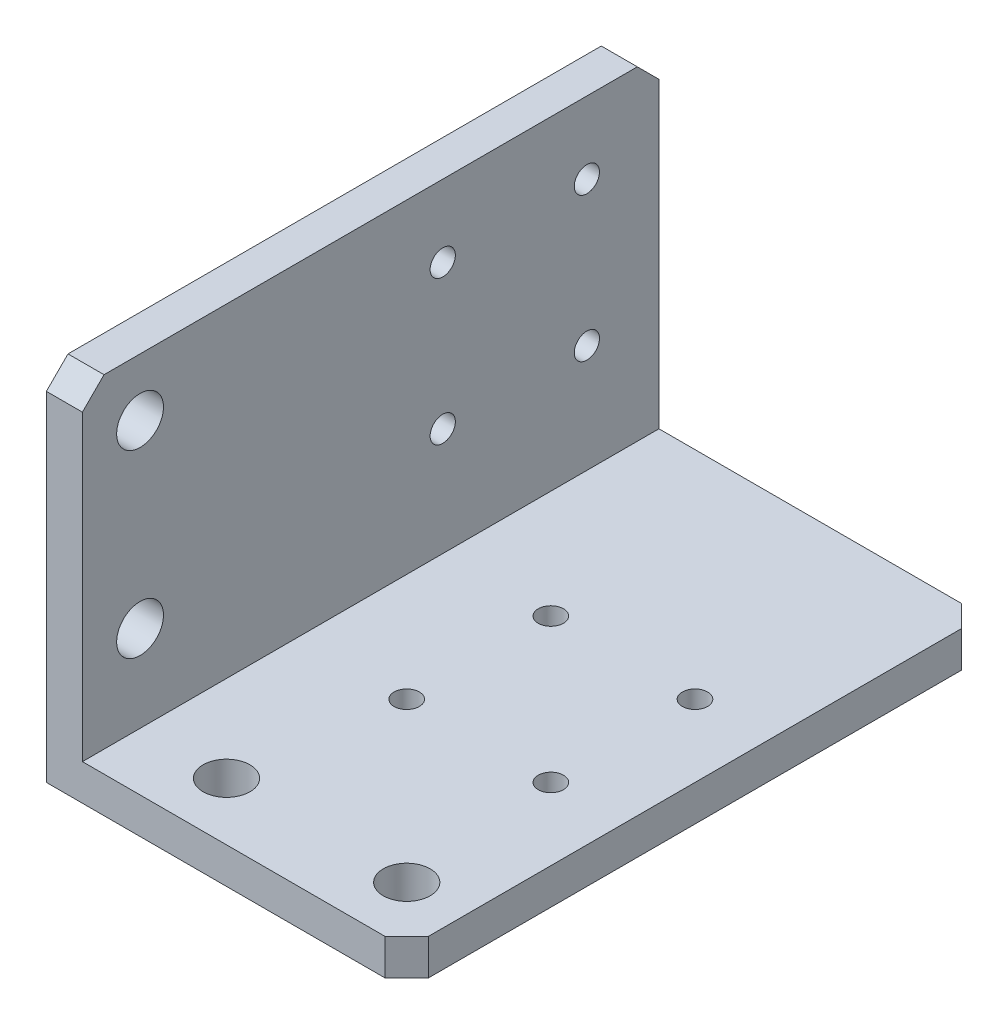
ISO-10303-21;
HEADER;
FILE_DESCRIPTION(('STEP AP214'),'2;1');
FILE_NAME('part.step','',(''),(''),'','','');
FILE_SCHEMA(('AUTOMOTIVE_DESIGN { 1 0 10303 214 1 1 1 1 }'));
ENDSEC;
DATA;
#1=APPLICATION_CONTEXT('core data for automotive mechanical design processes');
#2=APPLICATION_PROTOCOL_DEFINITION('international standard','automotive_design',2000,#1);
#3=PRODUCT_CONTEXT('',#1,'mechanical');
#4=PRODUCT('Part','Part','',(#3));
#5=PRODUCT_RELATED_PRODUCT_CATEGORY('part','',(#4));
#6=PRODUCT_DEFINITION_FORMATION('','',#4);
#7=PRODUCT_DEFINITION_CONTEXT('part definition',#1,'design');
#8=PRODUCT_DEFINITION('design','',#6,#7);
#9=PRODUCT_DEFINITION_SHAPE('','',#8);
#10=(LENGTH_UNIT() NAMED_UNIT(*) SI_UNIT(.MILLI.,.METRE.));
#11=(NAMED_UNIT(*) PLANE_ANGLE_UNIT() SI_UNIT($,.RADIAN.));
#12=(NAMED_UNIT(*) SI_UNIT($,.STERADIAN.) SOLID_ANGLE_UNIT());
#13=UNCERTAINTY_MEASURE_WITH_UNIT(LENGTH_MEASURE(1.E-05),#10,'distance_accuracy_value','');
#14=(GEOMETRIC_REPRESENTATION_CONTEXT(3) GLOBAL_UNCERTAINTY_ASSIGNED_CONTEXT((#13)) GLOBAL_UNIT_ASSIGNED_CONTEXT((#10,
#11,#12)) REPRESENTATION_CONTEXT('',''));
#15=CARTESIAN_POINT('',(0.,0.,0.));
#16=DIRECTION('',(0.,0.,1.));
#17=DIRECTION('',(1.,0.,0.));
#18=AXIS2_PLACEMENT_3D('',#15,#16,#17);
#19=CARTESIAN_POINT('',(50.,0.,80.));
#20=DIRECTION('',(0.,1.,0.));
#21=DIRECTION('',(-1.,0.,0.));
#22=AXIS2_PLACEMENT_3D('',#19,#20,#21);
#23=PLANE('',#22);
#24=CARTESIAN_POINT('',(40.0000000000001,0.,30.0000000000001));
#25=DIRECTION('',(0.,-1.,0.));
#26=DIRECTION('',(1.,0.,0.));
#27=AXIS2_PLACEMENT_3D('',#24,#25,#26);
#28=CIRCLE('',#27,1.75000000000001);
#29=CARTESIAN_POINT('',(41.7500000000001,0.,30.0000000000001));
#30=VERTEX_POINT('',#29);
#31=EDGE_CURVE('E297',#30,#30,#28,.T.);
#32=ORIENTED_EDGE('',*,*,#31,.F.);
#33=EDGE_LOOP('',(#32));
#34=FACE_BOUND('',#33,.T.);
#35=CARTESIAN_POINT('',(39.9999999999999,0.,50.0000000000001));
#36=DIRECTION('',(0.,-1.,0.));
#37=DIRECTION('',(1.,0.,0.));
#38=AXIS2_PLACEMENT_3D('',#35,#36,#37);
#39=CIRCLE('',#38,1.75);
#40=CARTESIAN_POINT('',(41.7499999999999,0.,50.0000000000001));
#41=VERTEX_POINT('',#40);
#42=EDGE_CURVE('E291',#41,#41,#39,.T.);
#43=ORIENTED_EDGE('',*,*,#42,.F.);
#44=EDGE_LOOP('',(#43));
#45=FACE_BOUND('',#44,.T.);
#46=CARTESIAN_POINT('',(19.9999999999999,0.,49.9999999999999));
#47=DIRECTION('',(0.,-1.,0.));
#48=DIRECTION('',(1.,0.,0.));
#49=AXIS2_PLACEMENT_3D('',#46,#47,#48);
#50=CIRCLE('',#49,1.75);
#51=CARTESIAN_POINT('',(21.7499999999999,0.,49.9999999999999));
#52=VERTEX_POINT('',#51);
#53=EDGE_CURVE('E285',#52,#52,#50,.T.);
#54=ORIENTED_EDGE('',*,*,#53,.F.);
#55=EDGE_LOOP('',(#54));
#56=FACE_BOUND('',#55,.T.);
#57=CARTESIAN_POINT('',(20.0000000000001,0.,29.9999999999999));
#58=DIRECTION('',(0.,-1.,0.));
#59=DIRECTION('',(1.,0.,0.));
#60=AXIS2_PLACEMENT_3D('',#57,#58,#59);
#61=CIRCLE('',#60,1.75);
#62=CARTESIAN_POINT('',(21.7500000000001,0.,29.9999999999999));
#63=VERTEX_POINT('',#62);
#64=EDGE_CURVE('E279',#63,#63,#61,.T.);
#65=ORIENTED_EDGE('',*,*,#64,.F.);
#66=EDGE_LOOP('',(#65));
#67=FACE_BOUND('',#66,.T.);
#68=CARTESIAN_POINT('',(17.,0.,72.));
#69=DIRECTION('',(0.,-1.,0.));
#70=DIRECTION('',(0.,0.,-1.));
#71=AXIS2_PLACEMENT_3D('',#68,#69,#70);
#72=CIRCLE('',#71,3.24999999999999);
#73=CARTESIAN_POINT('',(17.,0.,68.75));
#74=VERTEX_POINT('',#73);
#75=EDGE_CURVE('E237',#74,#74,#72,.T.);
#76=ORIENTED_EDGE('',*,*,#75,.F.);
#77=EDGE_LOOP('',(#76));
#78=FACE_BOUND('',#77,.T.);
#79=CARTESIAN_POINT('',(42.,0.,72.));
#80=DIRECTION('',(0.,-1.,0.));
#81=DIRECTION('',(0.,0.,-1.));
#82=AXIS2_PLACEMENT_3D('',#79,#80,#81);
#83=CIRCLE('',#82,3.24999999999999);
#84=CARTESIAN_POINT('',(42.,0.,68.75));
#85=VERTEX_POINT('',#84);
#86=EDGE_CURVE('E231',#85,#85,#83,.T.);
#87=ORIENTED_EDGE('',*,*,#86,.F.);
#88=EDGE_LOOP('',(#87));
#89=FACE_BOUND('',#88,.T.);
#90=DIRECTION('',(1.,0.,0.));
#91=VECTOR('',#90,1.);
#92=CARTESIAN_POINT('',(50.,0.,0.));
#93=LINE('',#92,#91);
#94=CARTESIAN_POINT('',(0.,0.,0.));
#95=VERTEX_POINT('',#94);
#96=CARTESIAN_POINT('',(47.,0.,0.));
#97=VERTEX_POINT('',#96);
#98=EDGE_CURVE('E155',#95,#97,#93,.T.);
#99=ORIENTED_EDGE('',*,*,#98,.T.);
#100=DIRECTION('',(0.707106781186548,0.,0.707106781186548));
#101=VECTOR('',#100,1.);
#102=CARTESIAN_POINT('',(50.,0.,3.00000000000002));
#103=LINE('',#102,#101);
#104=CARTESIAN_POINT('',(50.,0.,3.00000000000004));
#105=VERTEX_POINT('',#104);
#106=EDGE_CURVE('E200',#97,#105,#103,.T.);
#107=ORIENTED_EDGE('',*,*,#106,.T.);
#108=DIRECTION('',(0.,0.,-1.));
#109=VECTOR('',#108,1.);
#110=CARTESIAN_POINT('',(50.,0.,80.));
#111=LINE('',#110,#109);
#112=CARTESIAN_POINT('',(50.,0.,77.));
#113=VERTEX_POINT('',#112);
#114=EDGE_CURVE('E172',#113,#105,#111,.T.);
#115=ORIENTED_EDGE('',*,*,#114,.F.);
#116=DIRECTION('',(0.707106781186544,0.,-0.707106781186551));
#117=VECTOR('',#116,1.);
#118=CARTESIAN_POINT('',(47.,0.,80.));
#119=LINE('',#118,#117);
#120=CARTESIAN_POINT('',(47.,0.,80.));
#121=VERTEX_POINT('',#120);
#122=EDGE_CURVE('E59',#113,#121,#119,.F.);
#123=ORIENTED_EDGE('',*,*,#122,.T.);
#124=DIRECTION('',(1.,0.,0.));
#125=VECTOR('',#124,1.);
#126=CARTESIAN_POINT('',(50.,0.,80.));
#127=LINE('',#126,#125);
#128=CARTESIAN_POINT('',(0.,0.,80.));
#129=VERTEX_POINT('',#128);
#130=EDGE_CURVE('E131',#129,#121,#127,.T.);
#131=ORIENTED_EDGE('',*,*,#130,.F.);
#132=DIRECTION('',(0.,0.,-1.));
#133=VECTOR('',#132,1.);
#134=CARTESIAN_POINT('',(0.,0.,80.));
#135=LINE('',#134,#133);
#136=EDGE_CURVE('E151',#129,#95,#135,.T.);
#137=ORIENTED_EDGE('',*,*,#136,.T.);
#138=EDGE_LOOP('',(#99,#107,#115,#123,#131,#137));
#139=FACE_BOUND('',#138,.T.);
#140=ADVANCED_FACE('F44',(#34,#45,#56,#67,#78,#89,#139),#23,.F.);
#141=CARTESIAN_POINT('',(50.,5.,80.));
#142=DIRECTION('',(-1.,0.,0.));
#143=DIRECTION('',(0.,0.,1.));
#144=AXIS2_PLACEMENT_3D('',#141,#142,#143);
#145=PLANE('',#144);
#146=ORIENTED_EDGE('',*,*,#114,.T.);
#147=DIRECTION('',(0.,1.,0.));
#148=VECTOR('',#147,1.);
#149=CARTESIAN_POINT('',(50.,5.,3.00000000000002));
#150=LINE('',#149,#148);
#151=CARTESIAN_POINT('',(50.,5.,3.00000000000004));
#152=VERTEX_POINT('',#151);
#153=EDGE_CURVE('E193',#105,#152,#150,.T.);
#154=ORIENTED_EDGE('',*,*,#153,.T.);
#155=DIRECTION('',(0.,0.,-1.));
#156=VECTOR('',#155,1.);
#157=CARTESIAN_POINT('',(50.,5.,80.));
#158=LINE('',#157,#156);
#159=CARTESIAN_POINT('',(50.,5.,77.));
#160=VERTEX_POINT('',#159);
#161=EDGE_CURVE('E142',#160,#152,#158,.T.);
#162=ORIENTED_EDGE('',*,*,#161,.F.);
#163=DIRECTION('',(0.,-1.,0.));
#164=VECTOR('',#163,1.);
#165=CARTESIAN_POINT('',(50.,5.,77.));
#166=LINE('',#165,#164);
#167=EDGE_CURVE('E191',#160,#113,#166,.T.);
#168=ORIENTED_EDGE('',*,*,#167,.T.);
#169=EDGE_LOOP('',(#146,#154,#162,#168));
#170=FACE_BOUND('',#169,.T.);
#171=ADVANCED_FACE('F207',(#170),#145,.F.);
#172=CARTESIAN_POINT('',(5.00000000000001,5.,80.));
#173=DIRECTION('',(0.,-1.,0.));
#174=DIRECTION('',(1.,0.,0.));
#175=AXIS2_PLACEMENT_3D('',#172,#173,#174);
#176=PLANE('',#175);
#177=CARTESIAN_POINT('',(40.0000000000001,5.,30.0000000000001));
#178=DIRECTION('',(0.,-1.,0.));
#179=DIRECTION('',(1.,0.,0.));
#180=AXIS2_PLACEMENT_3D('',#177,#178,#179);
#181=CIRCLE('',#180,1.75000000000001);
#182=CARTESIAN_POINT('',(41.7500000000001,5.,30.0000000000001));
#183=VERTEX_POINT('',#182);
#184=EDGE_CURVE('E294',#183,#183,#181,.F.);
#185=ORIENTED_EDGE('',*,*,#184,.F.);
#186=EDGE_LOOP('',(#185));
#187=FACE_BOUND('',#186,.T.);
#188=CARTESIAN_POINT('',(39.9999999999999,5.,50.0000000000001));
#189=DIRECTION('',(0.,-1.,0.));
#190=DIRECTION('',(1.,0.,0.));
#191=AXIS2_PLACEMENT_3D('',#188,#189,#190);
#192=CIRCLE('',#191,1.75);
#193=CARTESIAN_POINT('',(41.7499999999999,5.,50.0000000000001));
#194=VERTEX_POINT('',#193);
#195=EDGE_CURVE('E288',#194,#194,#192,.F.);
#196=ORIENTED_EDGE('',*,*,#195,.F.);
#197=EDGE_LOOP('',(#196));
#198=FACE_BOUND('',#197,.T.);
#199=CARTESIAN_POINT('',(19.9999999999999,5.,49.9999999999999));
#200=DIRECTION('',(0.,-1.,0.));
#201=DIRECTION('',(1.,0.,0.));
#202=AXIS2_PLACEMENT_3D('',#199,#200,#201);
#203=CIRCLE('',#202,1.75);
#204=CARTESIAN_POINT('',(21.7499999999999,5.,49.9999999999999));
#205=VERTEX_POINT('',#204);
#206=EDGE_CURVE('E282',#205,#205,#203,.F.);
#207=ORIENTED_EDGE('',*,*,#206,.F.);
#208=EDGE_LOOP('',(#207));
#209=FACE_BOUND('',#208,.T.);
#210=CARTESIAN_POINT('',(20.0000000000001,5.,29.9999999999999));
#211=DIRECTION('',(0.,-1.,0.));
#212=DIRECTION('',(1.,0.,0.));
#213=AXIS2_PLACEMENT_3D('',#210,#211,#212);
#214=CIRCLE('',#213,1.75);
#215=CARTESIAN_POINT('',(21.7500000000001,5.,29.9999999999999));
#216=VERTEX_POINT('',#215);
#217=EDGE_CURVE('E276',#216,#216,#214,.F.);
#218=ORIENTED_EDGE('',*,*,#217,.F.);
#219=EDGE_LOOP('',(#218));
#220=FACE_BOUND('',#219,.T.);
#221=CARTESIAN_POINT('',(17.,5.,72.));
#222=DIRECTION('',(0.,-1.,0.));
#223=DIRECTION('',(1.,0.,0.));
#224=AXIS2_PLACEMENT_3D('',#221,#222,#223);
#225=CIRCLE('',#224,3.24999999999999);
#226=CARTESIAN_POINT('',(20.25,5.,72.));
#227=VERTEX_POINT('',#226);
#228=EDGE_CURVE('E234',#227,#227,#225,.T.);
#229=ORIENTED_EDGE('',*,*,#228,.T.);
#230=EDGE_LOOP('',(#229));
#231=FACE_BOUND('',#230,.T.);
#232=CARTESIAN_POINT('',(42.,5.,72.));
#233=DIRECTION('',(0.,-1.,0.));
#234=DIRECTION('',(1.,0.,0.));
#235=AXIS2_PLACEMENT_3D('',#232,#233,#234);
#236=CIRCLE('',#235,3.24999999999999);
#237=CARTESIAN_POINT('',(45.25,5.,72.));
#238=VERTEX_POINT('',#237);
#239=EDGE_CURVE('E158',#238,#238,#236,.T.);
#240=ORIENTED_EDGE('',*,*,#239,.T.);
#241=EDGE_LOOP('',(#240));
#242=FACE_BOUND('',#241,.T.);
#243=ORIENTED_EDGE('',*,*,#161,.T.);
#244=DIRECTION('',(-0.707106781186548,0.,-0.707106781186548));
#245=VECTOR('',#244,1.);
#246=CARTESIAN_POINT('',(50.,5.,3.00000000000002));
#247=LINE('',#246,#245);
#248=CARTESIAN_POINT('',(47.,5.,0.));
#249=VERTEX_POINT('',#248);
#250=EDGE_CURVE('E197',#152,#249,#247,.T.);
#251=ORIENTED_EDGE('',*,*,#250,.T.);
#252=DIRECTION('',(-1.,0.,0.));
#253=VECTOR('',#252,1.);
#254=CARTESIAN_POINT('',(5.00000000000001,5.,0.));
#255=LINE('',#254,#253);
#256=CARTESIAN_POINT('',(5.00000000000001,5.,0.));
#257=VERTEX_POINT('',#256);
#258=EDGE_CURVE('E138',#249,#257,#255,.T.);
#259=ORIENTED_EDGE('',*,*,#258,.T.);
#260=DIRECTION('',(0.,0.,-1.));
#261=VECTOR('',#260,1.);
#262=CARTESIAN_POINT('',(5.00000000000001,5.,80.));
#263=LINE('',#262,#261);
#264=CARTESIAN_POINT('',(5.00000000000001,5.,80.));
#265=VERTEX_POINT('',#264);
#266=EDGE_CURVE('E134',#265,#257,#263,.T.);
#267=ORIENTED_EDGE('',*,*,#266,.F.);
#268=DIRECTION('',(-1.,0.,0.));
#269=VECTOR('',#268,1.);
#270=CARTESIAN_POINT('',(5.00000000000001,5.,80.));
#271=LINE('',#270,#269);
#272=CARTESIAN_POINT('',(47.,5.,80.));
#273=VERTEX_POINT('',#272);
#274=EDGE_CURVE('E124',#273,#265,#271,.T.);
#275=ORIENTED_EDGE('',*,*,#274,.F.);
#276=DIRECTION('',(-0.707106781186544,0.,0.707106781186551));
#277=VECTOR('',#276,1.);
#278=CARTESIAN_POINT('',(47.,5.,80.));
#279=LINE('',#278,#277);
#280=EDGE_CURVE('E67',#273,#160,#279,.F.);
#281=ORIENTED_EDGE('',*,*,#280,.T.);
#282=EDGE_LOOP('',(#243,#251,#259,#267,#275,#281));
#283=FACE_BOUND('',#282,.T.);
#284=ADVANCED_FACE('F136',(#187,#198,#209,#220,#231,#242,#283),#176,.F.);
#285=CARTESIAN_POINT('',(5.,50.,80.));
#286=DIRECTION('',(-1.,0.,0.));
#287=DIRECTION('',(0.,-1.,0.));
#288=AXIS2_PLACEMENT_3D('',#285,#286,#287);
#289=PLANE('',#288);
#290=CARTESIAN_POINT('',(5.,20.,10.0000000000001));
#291=DIRECTION('',(-1.,0.,0.));
#292=DIRECTION('',(0.,-1.,0.));
#293=AXIS2_PLACEMENT_3D('',#290,#291,#292);
#294=CIRCLE('',#293,1.75);
#295=CARTESIAN_POINT('',(5.,18.25,10.0000000000001));
#296=VERTEX_POINT('',#295);
#297=EDGE_CURVE('E270',#296,#296,#294,.F.);
#298=ORIENTED_EDGE('',*,*,#297,.F.);
#299=EDGE_LOOP('',(#298));
#300=FACE_BOUND('',#299,.T.);
#301=CARTESIAN_POINT('',(5.,20.,30.));
#302=DIRECTION('',(-1.,0.,0.));
#303=DIRECTION('',(0.,-1.,0.));
#304=AXIS2_PLACEMENT_3D('',#301,#302,#303);
#305=CIRCLE('',#304,1.75);
#306=CARTESIAN_POINT('',(5.,18.25,30.));
#307=VERTEX_POINT('',#306);
#308=EDGE_CURVE('E264',#307,#307,#305,.F.);
#309=ORIENTED_EDGE('',*,*,#308,.F.);
#310=EDGE_LOOP('',(#309));
#311=FACE_BOUND('',#310,.T.);
#312=CARTESIAN_POINT('',(5.,40.,30.));
#313=DIRECTION('',(-1.,0.,0.));
#314=DIRECTION('',(0.,-1.,0.));
#315=AXIS2_PLACEMENT_3D('',#312,#313,#314);
#316=CIRCLE('',#315,1.75);
#317=CARTESIAN_POINT('',(5.,38.25,30.));
#318=VERTEX_POINT('',#317);
#319=EDGE_CURVE('E258',#318,#318,#316,.F.);
#320=ORIENTED_EDGE('',*,*,#319,.F.);
#321=EDGE_LOOP('',(#320));
#322=FACE_BOUND('',#321,.T.);
#323=CARTESIAN_POINT('',(5.,40.,10.));
#324=DIRECTION('',(-1.,0.,0.));
#325=DIRECTION('',(0.,-1.,0.));
#326=AXIS2_PLACEMENT_3D('',#323,#324,#325);
#327=CIRCLE('',#326,1.75);
#328=CARTESIAN_POINT('',(5.,38.25,10.));
#329=VERTEX_POINT('',#328);
#330=EDGE_CURVE('E252',#329,#329,#327,.F.);
#331=ORIENTED_EDGE('',*,*,#330,.F.);
#332=EDGE_LOOP('',(#331));
#333=FACE_BOUND('',#332,.T.);
#334=CARTESIAN_POINT('',(5.,42.,72.));
#335=DIRECTION('',(-1.,0.,0.));
#336=DIRECTION('',(0.,0.,1.));
#337=AXIS2_PLACEMENT_3D('',#334,#335,#336);
#338=CIRCLE('',#337,3.25);
#339=CARTESIAN_POINT('',(5.,42.,75.25));
#340=VERTEX_POINT('',#339);
#341=EDGE_CURVE('E246',#340,#340,#338,.T.);
#342=ORIENTED_EDGE('',*,*,#341,.T.);
#343=EDGE_LOOP('',(#342));
#344=FACE_BOUND('',#343,.T.);
#345=CARTESIAN_POINT('',(5.,17.,72.));
#346=DIRECTION('',(-1.,0.,0.));
#347=DIRECTION('',(0.,0.,1.));
#348=AXIS2_PLACEMENT_3D('',#345,#346,#347);
#349=CIRCLE('',#348,3.25);
#350=CARTESIAN_POINT('',(5.,17.,75.25));
#351=VERTEX_POINT('',#350);
#352=EDGE_CURVE('E240',#351,#351,#349,.T.);
#353=ORIENTED_EDGE('',*,*,#352,.T.);
#354=EDGE_LOOP('',(#353));
#355=FACE_BOUND('',#354,.T.);
#356=DIRECTION('',(0.,1.,0.));
#357=VECTOR('',#356,1.);
#358=CARTESIAN_POINT('',(5.,50.,0.));
#359=LINE('',#358,#357);
#360=CARTESIAN_POINT('',(5.,47.,0.));
#361=VERTEX_POINT('',#360);
#362=EDGE_CURVE('E160',#257,#361,#359,.T.);
#363=ORIENTED_EDGE('',*,*,#362,.T.);
#364=DIRECTION('',(0.,0.707106781186548,0.707106781186548));
#365=VECTOR('',#364,1.);
#366=CARTESIAN_POINT('',(5.,50.,3.00000000000002));
#367=LINE('',#366,#365);
#368=CARTESIAN_POINT('',(5.,50.,3.00000000000004));
#369=VERTEX_POINT('',#368);
#370=EDGE_CURVE('E189',#361,#369,#367,.T.);
#371=ORIENTED_EDGE('',*,*,#370,.T.);
#372=DIRECTION('',(0.,0.,-1.));
#373=VECTOR('',#372,1.);
#374=CARTESIAN_POINT('',(5.,50.,80.));
#375=LINE('',#374,#373);
#376=CARTESIAN_POINT('',(5.,50.,77.));
#377=VERTEX_POINT('',#376);
#378=EDGE_CURVE('E143',#377,#369,#375,.T.);
#379=ORIENTED_EDGE('',*,*,#378,.F.);
#380=DIRECTION('',(0.,0.707106781186544,-0.707106781186551));
#381=VECTOR('',#380,1.);
#382=CARTESIAN_POINT('',(5.,47.,80.));
#383=LINE('',#382,#381);
#384=CARTESIAN_POINT('',(5.,47.,80.));
#385=VERTEX_POINT('',#384);
#386=EDGE_CURVE('E148',#377,#385,#383,.F.);
#387=ORIENTED_EDGE('',*,*,#386,.T.);
#388=DIRECTION('',(0.,1.,0.));
#389=VECTOR('',#388,1.);
#390=CARTESIAN_POINT('',(5.,50.,80.));
#391=LINE('',#390,#389);
#392=EDGE_CURVE('E128',#265,#385,#391,.T.);
#393=ORIENTED_EDGE('',*,*,#392,.F.);
#394=ORIENTED_EDGE('',*,*,#266,.T.);
#395=EDGE_LOOP('',(#363,#371,#379,#387,#393,#394));
#396=FACE_BOUND('',#395,.T.);
#397=ADVANCED_FACE('F145',(#300,#311,#322,#333,#344,#355,#396),#289,.F.);
#398=CARTESIAN_POINT('',(0.,50.,80.));
#399=DIRECTION('',(0.,-1.,0.));
#400=DIRECTION('',(0.,0.,-1.));
#401=AXIS2_PLACEMENT_3D('',#398,#399,#400);
#402=PLANE('',#401);
#403=ORIENTED_EDGE('',*,*,#378,.T.);
#404=DIRECTION('',(-1.,0.,0.));
#405=VECTOR('',#404,1.);
#406=CARTESIAN_POINT('',(0.,50.,3.00000000000002));
#407=LINE('',#406,#405);
#408=CARTESIAN_POINT('',(0.,50.,3.00000000000004));
#409=VERTEX_POINT('',#408);
#410=EDGE_CURVE('E177',#369,#409,#407,.T.);
#411=ORIENTED_EDGE('',*,*,#410,.T.);
#412=DIRECTION('',(0.,0.,-1.));
#413=VECTOR('',#412,1.);
#414=CARTESIAN_POINT('',(0.,50.,80.));
#415=LINE('',#414,#413);
#416=CARTESIAN_POINT('',(0.,50.,77.));
#417=VERTEX_POINT('',#416);
#418=EDGE_CURVE('E166',#417,#409,#415,.T.);
#419=ORIENTED_EDGE('',*,*,#418,.F.);
#420=DIRECTION('',(1.,0.,0.));
#421=VECTOR('',#420,1.);
#422=CARTESIAN_POINT('',(0.,50.,77.));
#423=LINE('',#422,#421);
#424=EDGE_CURVE('E175',#417,#377,#423,.T.);
#425=ORIENTED_EDGE('',*,*,#424,.T.);
#426=EDGE_LOOP('',(#403,#411,#419,#425));
#427=FACE_BOUND('',#426,.T.);
#428=ADVANCED_FACE('F220',(#427),#402,.F.);
#429=CARTESIAN_POINT('',(0.,0.,80.));
#430=DIRECTION('',(1.,0.,0.));
#431=DIRECTION('',(0.,0.,-1.));
#432=AXIS2_PLACEMENT_3D('',#429,#430,#431);
#433=PLANE('',#432);
#434=CARTESIAN_POINT('',(0.,20.,10.0000000000001));
#435=DIRECTION('',(-1.,0.,0.));
#436=DIRECTION('',(0.,0.,1.));
#437=AXIS2_PLACEMENT_3D('',#434,#435,#436);
#438=CIRCLE('',#437,1.75);
#439=CARTESIAN_POINT('',(0.,20.,11.7500000000001));
#440=VERTEX_POINT('',#439);
#441=EDGE_CURVE('E273',#440,#440,#438,.T.);
#442=ORIENTED_EDGE('',*,*,#441,.F.);
#443=EDGE_LOOP('',(#442));
#444=FACE_BOUND('',#443,.T.);
#445=CARTESIAN_POINT('',(0.,20.,30.));
#446=DIRECTION('',(-1.,0.,0.));
#447=DIRECTION('',(0.,0.,1.));
#448=AXIS2_PLACEMENT_3D('',#445,#446,#447);
#449=CIRCLE('',#448,1.75);
#450=CARTESIAN_POINT('',(0.,20.,31.75));
#451=VERTEX_POINT('',#450);
#452=EDGE_CURVE('E267',#451,#451,#449,.T.);
#453=ORIENTED_EDGE('',*,*,#452,.F.);
#454=EDGE_LOOP('',(#453));
#455=FACE_BOUND('',#454,.T.);
#456=CARTESIAN_POINT('',(0.,40.,30.));
#457=DIRECTION('',(-1.,0.,0.));
#458=DIRECTION('',(0.,0.,1.));
#459=AXIS2_PLACEMENT_3D('',#456,#457,#458);
#460=CIRCLE('',#459,1.75);
#461=CARTESIAN_POINT('',(0.,40.,31.75));
#462=VERTEX_POINT('',#461);
#463=EDGE_CURVE('E261',#462,#462,#460,.T.);
#464=ORIENTED_EDGE('',*,*,#463,.F.);
#465=EDGE_LOOP('',(#464));
#466=FACE_BOUND('',#465,.T.);
#467=CARTESIAN_POINT('',(0.,40.,10.));
#468=DIRECTION('',(-1.,0.,0.));
#469=DIRECTION('',(0.,0.,1.));
#470=AXIS2_PLACEMENT_3D('',#467,#468,#469);
#471=CIRCLE('',#470,1.75);
#472=CARTESIAN_POINT('',(0.,40.,11.75));
#473=VERTEX_POINT('',#472);
#474=EDGE_CURVE('E255',#473,#473,#471,.T.);
#475=ORIENTED_EDGE('',*,*,#474,.F.);
#476=EDGE_LOOP('',(#475));
#477=FACE_BOUND('',#476,.T.);
#478=CARTESIAN_POINT('',(0.,42.,72.));
#479=DIRECTION('',(-1.,0.,0.));
#480=DIRECTION('',(0.,0.,1.));
#481=AXIS2_PLACEMENT_3D('',#478,#479,#480);
#482=CIRCLE('',#481,3.24999999999999);
#483=CARTESIAN_POINT('',(0.,42.,75.25));
#484=VERTEX_POINT('',#483);
#485=EDGE_CURVE('E249',#484,#484,#482,.T.);
#486=ORIENTED_EDGE('',*,*,#485,.F.);
#487=EDGE_LOOP('',(#486));
#488=FACE_BOUND('',#487,.T.);
#489=CARTESIAN_POINT('',(0.,17.,72.));
#490=DIRECTION('',(-1.,0.,0.));
#491=DIRECTION('',(0.,0.,1.));
#492=AXIS2_PLACEMENT_3D('',#489,#490,#491);
#493=CIRCLE('',#492,3.24999999999999);
#494=CARTESIAN_POINT('',(0.,17.,75.25));
#495=VERTEX_POINT('',#494);
#496=EDGE_CURVE('E243',#495,#495,#493,.T.);
#497=ORIENTED_EDGE('',*,*,#496,.F.);
#498=EDGE_LOOP('',(#497));
#499=FACE_BOUND('',#498,.T.);
#500=ORIENTED_EDGE('',*,*,#418,.T.);
#501=DIRECTION('',(0.,-0.707106781186548,-0.707106781186548));
#502=VECTOR('',#501,1.);
#503=CARTESIAN_POINT('',(0.,50.,3.00000000000002));
#504=LINE('',#503,#502);
#505=CARTESIAN_POINT('',(0.,47.,0.));
#506=VERTEX_POINT('',#505);
#507=EDGE_CURVE('E182',#409,#506,#504,.T.);
#508=ORIENTED_EDGE('',*,*,#507,.T.);
#509=DIRECTION('',(0.,-1.,0.));
#510=VECTOR('',#509,1.);
#511=CARTESIAN_POINT('',(0.,0.,0.));
#512=LINE('',#511,#510);
#513=EDGE_CURVE('E162',#506,#95,#512,.T.);
#514=ORIENTED_EDGE('',*,*,#513,.T.);
#515=ORIENTED_EDGE('',*,*,#136,.F.);
#516=DIRECTION('',(0.,-1.,0.));
#517=VECTOR('',#516,1.);
#518=CARTESIAN_POINT('',(0.,0.,80.));
#519=LINE('',#518,#517);
#520=CARTESIAN_POINT('',(0.,47.,80.));
#521=VERTEX_POINT('',#520);
#522=EDGE_CURVE('E149',#521,#129,#519,.T.);
#523=ORIENTED_EDGE('',*,*,#522,.F.);
#524=DIRECTION('',(0.,-0.707106781186544,0.707106781186551));
#525=VECTOR('',#524,1.);
#526=CARTESIAN_POINT('',(0.,47.,80.));
#527=LINE('',#526,#525);
#528=EDGE_CURVE('E180',#521,#417,#527,.F.);
#529=ORIENTED_EDGE('',*,*,#528,.T.);
#530=EDGE_LOOP('',(#500,#508,#514,#515,#523,#529));
#531=FACE_BOUND('',#530,.T.);
#532=ADVANCED_FACE('F223',(#444,#455,#466,#477,#488,#499,#531),#433,.F.);
#533=CARTESIAN_POINT('',(0.,0.,80.));
#534=DIRECTION('',(0.,0.,-1.));
#535=DIRECTION('',(-1.,0.,0.));
#536=AXIS2_PLACEMENT_3D('',#533,#534,#535);
#537=PLANE('',#536);
#538=ORIENTED_EDGE('',*,*,#392,.T.);
#539=DIRECTION('',(-1.,0.,0.));
#540=VECTOR('',#539,1.);
#541=CARTESIAN_POINT('',(0.,47.,80.));
#542=LINE('',#541,#540);
#543=EDGE_CURVE('E13',#385,#521,#542,.T.);
#544=ORIENTED_EDGE('',*,*,#543,.T.);
#545=ORIENTED_EDGE('',*,*,#522,.T.);
#546=ORIENTED_EDGE('',*,*,#130,.T.);
#547=DIRECTION('',(0.,1.,0.));
#548=VECTOR('',#547,1.);
#549=CARTESIAN_POINT('',(47.,0.,80.));
#550=LINE('',#549,#548);
#551=EDGE_CURVE('E52',#121,#273,#550,.T.);
#552=ORIENTED_EDGE('',*,*,#551,.T.);
#553=ORIENTED_EDGE('',*,*,#274,.T.);
#554=EDGE_LOOP('',(#538,#544,#545,#546,#552,#553));
#555=FACE_BOUND('',#554,.T.);
#556=ADVANCED_FACE('F126',(#555),#537,.F.);
#557=CARTESIAN_POINT('',(0.,0.,0.));
#558=DIRECTION('',(0.,0.,-1.));
#559=DIRECTION('',(-1.,0.,0.));
#560=AXIS2_PLACEMENT_3D('',#557,#558,#559);
#561=PLANE('',#560);
#562=ORIENTED_EDGE('',*,*,#513,.F.);
#563=DIRECTION('',(1.,0.,0.));
#564=VECTOR('',#563,1.);
#565=CARTESIAN_POINT('',(5.,47.,0.));
#566=LINE('',#565,#564);
#567=EDGE_CURVE('E186',#506,#361,#566,.T.);
#568=ORIENTED_EDGE('',*,*,#567,.T.);
#569=ORIENTED_EDGE('',*,*,#362,.F.);
#570=ORIENTED_EDGE('',*,*,#258,.F.);
#571=DIRECTION('',(0.,-1.,0.));
#572=VECTOR('',#571,1.);
#573=CARTESIAN_POINT('',(47.,0.,0.));
#574=LINE('',#573,#572);
#575=EDGE_CURVE('E184',#249,#97,#574,.T.);
#576=ORIENTED_EDGE('',*,*,#575,.T.);
#577=ORIENTED_EDGE('',*,*,#98,.F.);
#578=EDGE_LOOP('',(#562,#568,#569,#570,#576,#577));
#579=FACE_BOUND('',#578,.T.);
#580=ADVANCED_FACE('F212',(#579),#561,.T.);
#581=CARTESIAN_POINT('',(42.,0.,72.));
#582=DIRECTION('',(0.,-1.,0.));
#583=DIRECTION('',(0.,0.,-1.));
#584=AXIS2_PLACEMENT_3D('',#581,#582,#583);
#585=CYLINDRICAL_SURFACE('',#584,3.24999999999999);
#586=ORIENTED_EDGE('',*,*,#86,.T.);
#587=EDGE_LOOP('',(#586));
#588=FACE_BOUND('',#587,.T.);
#589=ORIENTED_EDGE('',*,*,#239,.F.);
#590=EDGE_LOOP('',(#589));
#591=FACE_BOUND('',#590,.T.);
#592=ADVANCED_FACE('F317',(#588,#591),#585,.F.);
#593=CARTESIAN_POINT('',(17.,0.,72.));
#594=DIRECTION('',(0.,-1.,0.));
#595=DIRECTION('',(0.,0.,-1.));
#596=AXIS2_PLACEMENT_3D('',#593,#594,#595);
#597=CYLINDRICAL_SURFACE('',#596,3.24999999999999);
#598=ORIENTED_EDGE('',*,*,#75,.T.);
#599=EDGE_LOOP('',(#598));
#600=FACE_BOUND('',#599,.T.);
#601=ORIENTED_EDGE('',*,*,#228,.F.);
#602=EDGE_LOOP('',(#601));
#603=FACE_BOUND('',#602,.T.);
#604=ADVANCED_FACE('F320',(#600,#603),#597,.F.);
#605=CARTESIAN_POINT('',(0.,17.,72.));
#606=DIRECTION('',(-1.,0.,0.));
#607=DIRECTION('',(0.,0.,1.));
#608=AXIS2_PLACEMENT_3D('',#605,#606,#607);
#609=CYLINDRICAL_SURFACE('',#608,3.24999999999999);
#610=ORIENTED_EDGE('',*,*,#352,.F.);
#611=EDGE_LOOP('',(#610));
#612=FACE_BOUND('',#611,.T.);
#613=ORIENTED_EDGE('',*,*,#496,.T.);
#614=EDGE_LOOP('',(#613));
#615=FACE_BOUND('',#614,.T.);
#616=ADVANCED_FACE('F506',(#612,#615),#609,.F.);
#617=CARTESIAN_POINT('',(0.,42.,72.));
#618=DIRECTION('',(-1.,0.,0.));
#619=DIRECTION('',(0.,0.,1.));
#620=AXIS2_PLACEMENT_3D('',#617,#618,#619);
#621=CYLINDRICAL_SURFACE('',#620,3.24999999999999);
#622=ORIENTED_EDGE('',*,*,#341,.F.);
#623=EDGE_LOOP('',(#622));
#624=FACE_BOUND('',#623,.T.);
#625=ORIENTED_EDGE('',*,*,#485,.T.);
#626=EDGE_LOOP('',(#625));
#627=FACE_BOUND('',#626,.T.);
#628=ADVANCED_FACE('F496',(#624,#627),#621,.F.);
#629=CARTESIAN_POINT('',(50.001,40.,10.));
#630=DIRECTION('',(-1.,0.,0.));
#631=DIRECTION('',(0.,0.,1.));
#632=AXIS2_PLACEMENT_3D('',#629,#630,#631);
#633=CYLINDRICAL_SURFACE('',#632,1.75);
#634=ORIENTED_EDGE('',*,*,#474,.T.);
#635=EDGE_LOOP('',(#634));
#636=FACE_BOUND('',#635,.T.);
#637=ORIENTED_EDGE('',*,*,#330,.T.);
#638=EDGE_LOOP('',(#637));
#639=FACE_BOUND('',#638,.T.);
#640=ADVANCED_FACE('F486',(#636,#639),#633,.F.);
#641=CARTESIAN_POINT('',(50.001,40.,30.));
#642=DIRECTION('',(-1.,0.,0.));
#643=DIRECTION('',(0.,0.,1.));
#644=AXIS2_PLACEMENT_3D('',#641,#642,#643);
#645=CYLINDRICAL_SURFACE('',#644,1.75);
#646=ORIENTED_EDGE('',*,*,#463,.T.);
#647=EDGE_LOOP('',(#646));
#648=FACE_BOUND('',#647,.T.);
#649=ORIENTED_EDGE('',*,*,#319,.T.);
#650=EDGE_LOOP('',(#649));
#651=FACE_BOUND('',#650,.T.);
#652=ADVANCED_FACE('F476',(#648,#651),#645,.F.);
#653=CARTESIAN_POINT('',(50.001,20.,30.));
#654=DIRECTION('',(-1.,0.,0.));
#655=DIRECTION('',(0.,0.,1.));
#656=AXIS2_PLACEMENT_3D('',#653,#654,#655);
#657=CYLINDRICAL_SURFACE('',#656,1.75);
#658=ORIENTED_EDGE('',*,*,#452,.T.);
#659=EDGE_LOOP('',(#658));
#660=FACE_BOUND('',#659,.T.);
#661=ORIENTED_EDGE('',*,*,#308,.T.);
#662=EDGE_LOOP('',(#661));
#663=FACE_BOUND('',#662,.T.);
#664=ADVANCED_FACE('F466',(#660,#663),#657,.F.);
#665=CARTESIAN_POINT('',(50.001,20.,10.0000000000001));
#666=DIRECTION('',(-1.,0.,0.));
#667=DIRECTION('',(0.,0.,1.));
#668=AXIS2_PLACEMENT_3D('',#665,#666,#667);
#669=CYLINDRICAL_SURFACE('',#668,1.75);
#670=ORIENTED_EDGE('',*,*,#441,.T.);
#671=EDGE_LOOP('',(#670));
#672=FACE_BOUND('',#671,.T.);
#673=ORIENTED_EDGE('',*,*,#297,.T.);
#674=EDGE_LOOP('',(#673));
#675=FACE_BOUND('',#674,.T.);
#676=ADVANCED_FACE('F456',(#672,#675),#669,.F.);
#677=CARTESIAN_POINT('',(20.0000000000001,50.001,29.9999999999999));
#678=DIRECTION('',(0.,-1.,0.));
#679=DIRECTION('',(1.,0.,0.));
#680=AXIS2_PLACEMENT_3D('',#677,#678,#679);
#681=CYLINDRICAL_SURFACE('',#680,1.75);
#682=ORIENTED_EDGE('',*,*,#64,.T.);
#683=EDGE_LOOP('',(#682));
#684=FACE_BOUND('',#683,.T.);
#685=ORIENTED_EDGE('',*,*,#217,.T.);
#686=EDGE_LOOP('',(#685));
#687=FACE_BOUND('',#686,.T.);
#688=ADVANCED_FACE('F446',(#684,#687),#681,.F.);
#689=CARTESIAN_POINT('',(19.9999999999999,50.001,49.9999999999999));
#690=DIRECTION('',(0.,-1.,0.));
#691=DIRECTION('',(1.,0.,0.));
#692=AXIS2_PLACEMENT_3D('',#689,#690,#691);
#693=CYLINDRICAL_SURFACE('',#692,1.75);
#694=ORIENTED_EDGE('',*,*,#53,.T.);
#695=EDGE_LOOP('',(#694));
#696=FACE_BOUND('',#695,.T.);
#697=ORIENTED_EDGE('',*,*,#206,.T.);
#698=EDGE_LOOP('',(#697));
#699=FACE_BOUND('',#698,.T.);
#700=ADVANCED_FACE('F436',(#696,#699),#693,.F.);
#701=CARTESIAN_POINT('',(39.9999999999999,50.001,50.0000000000001));
#702=DIRECTION('',(0.,-1.,0.));
#703=DIRECTION('',(1.,0.,0.));
#704=AXIS2_PLACEMENT_3D('',#701,#702,#703);
#705=CYLINDRICAL_SURFACE('',#704,1.75);
#706=ORIENTED_EDGE('',*,*,#42,.T.);
#707=EDGE_LOOP('',(#706));
#708=FACE_BOUND('',#707,.T.);
#709=ORIENTED_EDGE('',*,*,#195,.T.);
#710=EDGE_LOOP('',(#709));
#711=FACE_BOUND('',#710,.T.);
#712=ADVANCED_FACE('F427',(#708,#711),#705,.F.);
#713=CARTESIAN_POINT('',(40.0000000000001,50.001,30.0000000000001));
#714=DIRECTION('',(0.,-1.,0.));
#715=DIRECTION('',(1.,0.,0.));
#716=AXIS2_PLACEMENT_3D('',#713,#714,#715);
#717=CYLINDRICAL_SURFACE('',#716,1.75000000000001);
#718=ORIENTED_EDGE('',*,*,#31,.T.);
#719=EDGE_LOOP('',(#718));
#720=FACE_BOUND('',#719,.T.);
#721=ORIENTED_EDGE('',*,*,#184,.T.);
#722=EDGE_LOOP('',(#721));
#723=FACE_BOUND('',#722,.T.);
#724=ADVANCED_FACE('F301',(#720,#723),#717,.F.);
#725=CARTESIAN_POINT('',(0.,50.,3.00000000000002));
#726=DIRECTION('',(0.,0.707106781186548,-0.707106781186548));
#727=DIRECTION('',(1.,0.,0.));
#728=AXIS2_PLACEMENT_3D('',#725,#726,#727);
#729=PLANE('',#728);
#730=ORIENTED_EDGE('',*,*,#370,.F.);
#731=ORIENTED_EDGE('',*,*,#567,.F.);
#732=ORIENTED_EDGE('',*,*,#507,.F.);
#733=ORIENTED_EDGE('',*,*,#410,.F.);
#734=EDGE_LOOP('',(#730,#731,#732,#733));
#735=FACE_BOUND('',#734,.T.);
#736=ADVANCED_FACE('F217',(#735),#729,.T.);
#737=CARTESIAN_POINT('',(50.,5.,3.00000000000002));
#738=DIRECTION('',(0.707106781186548,0.,-0.707106781186548));
#739=DIRECTION('',(0.,-1.,0.));
#740=AXIS2_PLACEMENT_3D('',#737,#738,#739);
#741=PLANE('',#740);
#742=ORIENTED_EDGE('',*,*,#106,.F.);
#743=ORIENTED_EDGE('',*,*,#575,.F.);
#744=ORIENTED_EDGE('',*,*,#250,.F.);
#745=ORIENTED_EDGE('',*,*,#153,.F.);
#746=EDGE_LOOP('',(#742,#743,#744,#745));
#747=FACE_BOUND('',#746,.T.);
#748=ADVANCED_FACE('F209',(#747),#741,.T.);
#749=CARTESIAN_POINT('',(0.,47.,80.));
#750=DIRECTION('',(0.,-0.707106781186551,-0.707106781186544));
#751=DIRECTION('',(-1.,0.,0.));
#752=AXIS2_PLACEMENT_3D('',#749,#750,#751);
#753=PLANE('',#752);
#754=ORIENTED_EDGE('',*,*,#386,.F.);
#755=ORIENTED_EDGE('',*,*,#424,.F.);
#756=ORIENTED_EDGE('',*,*,#528,.F.);
#757=ORIENTED_EDGE('',*,*,#543,.F.);
#758=EDGE_LOOP('',(#754,#755,#756,#757));
#759=FACE_BOUND('',#758,.T.);
#760=ADVANCED_FACE('F227',(#759),#753,.F.);
#761=CARTESIAN_POINT('',(47.,0.,80.));
#762=DIRECTION('',(-0.707106781186551,0.,-0.707106781186544));
#763=DIRECTION('',(0.,1.,0.));
#764=AXIS2_PLACEMENT_3D('',#761,#762,#763);
#765=PLANE('',#764);
#766=ORIENTED_EDGE('',*,*,#122,.F.);
#767=ORIENTED_EDGE('',*,*,#167,.F.);
#768=ORIENTED_EDGE('',*,*,#280,.F.);
#769=ORIENTED_EDGE('',*,*,#551,.F.);
#770=EDGE_LOOP('',(#766,#767,#768,#769));
#771=FACE_BOUND('',#770,.T.);
#772=ADVANCED_FACE('F46',(#771),#765,.F.);
#773=CLOSED_SHELL('',(#140,#171,#284,#397,#428,#532,#556,#580,#592,#604,#616,#628,#640,#652,
#664,#676,#688,#700,#712,#724,#736,#748,#760,#772));
#774=MANIFOLD_SOLID_BREP('B2',#773);
#775=ADVANCED_BREP_SHAPE_REPRESENTATION('',(#18,#774),#14);
#776=SHAPE_DEFINITION_REPRESENTATION(#9,#775);
ENDSEC;
END-ISO-10303-21;
